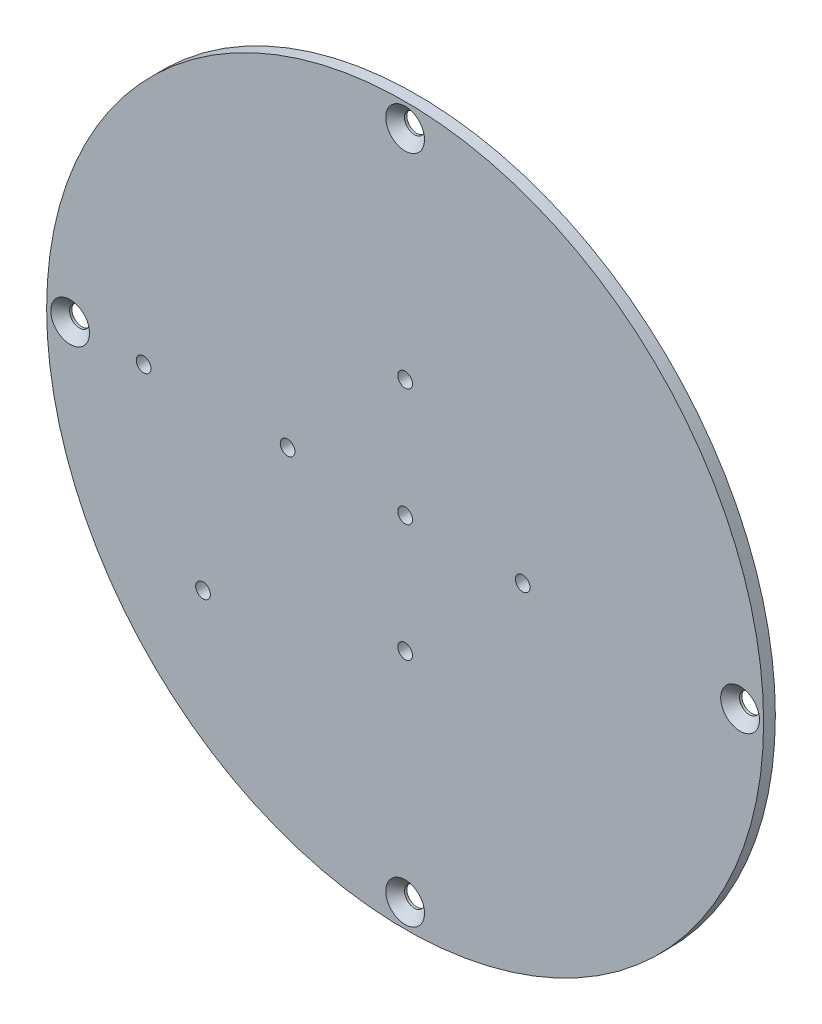
ISO-10303-21;
HEADER;
FILE_DESCRIPTION(('STEP AP214'),'2;1');
FILE_NAME('part.step','',(''),(''),'','','');
FILE_SCHEMA(('AUTOMOTIVE_DESIGN { 1 0 10303 214 1 1 1 1 }'));
ENDSEC;
DATA;
#1=APPLICATION_CONTEXT('core data for automotive mechanical design processes');
#2=APPLICATION_PROTOCOL_DEFINITION('international standard','automotive_design',2000,#1);
#3=PRODUCT_CONTEXT('',#1,'mechanical');
#4=PRODUCT('Part','Part','',(#3));
#5=PRODUCT_RELATED_PRODUCT_CATEGORY('part','',(#4));
#6=PRODUCT_DEFINITION_FORMATION('','',#4);
#7=PRODUCT_DEFINITION_CONTEXT('part definition',#1,'design');
#8=PRODUCT_DEFINITION('design','',#6,#7);
#9=PRODUCT_DEFINITION_SHAPE('','',#8);
#10=(LENGTH_UNIT() NAMED_UNIT(*) SI_UNIT(.MILLI.,.METRE.));
#11=(NAMED_UNIT(*) PLANE_ANGLE_UNIT() SI_UNIT($,.RADIAN.));
#12=(NAMED_UNIT(*) SI_UNIT($,.STERADIAN.) SOLID_ANGLE_UNIT());
#13=UNCERTAINTY_MEASURE_WITH_UNIT(LENGTH_MEASURE(1.E-05),#10,'distance_accuracy_value','');
#14=(GEOMETRIC_REPRESENTATION_CONTEXT(3) GLOBAL_UNCERTAINTY_ASSIGNED_CONTEXT((#13)) GLOBAL_UNIT_ASSIGNED_CONTEXT((#10,
#11,#12)) REPRESENTATION_CONTEXT('',''));
#15=CARTESIAN_POINT('',(0.,0.,0.));
#16=DIRECTION('',(0.,0.,1.));
#17=DIRECTION('',(1.,0.,0.));
#18=AXIS2_PLACEMENT_3D('',#15,#16,#17);
#19=CARTESIAN_POINT('',(0.,0.,2.));
#20=DIRECTION('',(0.,0.,-1.));
#21=DIRECTION('',(-1.,0.,0.));
#22=AXIS2_PLACEMENT_3D('',#19,#20,#21);
#23=CYLINDRICAL_SURFACE('',#22,61.);
#24=CARTESIAN_POINT('',(0.,0.,2.));
#25=DIRECTION('',(0.,0.,1.));
#26=DIRECTION('',(1.,0.,0.));
#27=AXIS2_PLACEMENT_3D('',#24,#25,#26);
#28=CIRCLE('',#27,61.);
#29=CARTESIAN_POINT('',(61.,0.,2.));
#30=VERTEX_POINT('',#29);
#31=EDGE_CURVE('E10',#30,#30,#28,.T.);
#32=ORIENTED_EDGE('',*,*,#31,.F.);
#33=EDGE_LOOP('',(#32));
#34=FACE_BOUND('',#33,.T.);
#35=CARTESIAN_POINT('',(0.,0.,0.));
#36=DIRECTION('',(0.,0.,1.));
#37=DIRECTION('',(1.,0.,0.));
#38=AXIS2_PLACEMENT_3D('',#35,#36,#37);
#39=CIRCLE('',#38,61.);
#40=CARTESIAN_POINT('',(61.,0.,0.));
#41=VERTEX_POINT('',#40);
#42=EDGE_CURVE('E37',#41,#41,#39,.T.);
#43=ORIENTED_EDGE('',*,*,#42,.T.);
#44=EDGE_LOOP('',(#43));
#45=FACE_BOUND('',#44,.T.);
#46=ADVANCED_FACE('F34',(#34,#45),#23,.T.);
#47=CARTESIAN_POINT('',(0.,0.,2.));
#48=DIRECTION('',(0.,0.,1.));
#49=DIRECTION('',(1.,0.,0.));
#50=AXIS2_PLACEMENT_3D('',#47,#48,#49);
#51=PLANE('',#50);
#52=CARTESIAN_POINT('',(-34.3876404494382,-28.2442947215922,2.));
#53=DIRECTION('',(0.,0.,-1.));
#54=DIRECTION('',(-1.,0.,0.));
#55=AXIS2_PLACEMENT_3D('',#52,#53,#54);
#56=CIRCLE('',#55,1.25);
#57=CARTESIAN_POINT('',(-35.6376404494382,-28.2442947215922,2.));
#58=VERTEX_POINT('',#57);
#59=EDGE_CURVE('E117',#58,#58,#56,.T.);
#60=ORIENTED_EDGE('',*,*,#59,.T.);
#61=EDGE_LOOP('',(#60));
#62=FACE_BOUND('',#61,.T.);
#63=CARTESIAN_POINT('',(-44.5,0.,2.));
#64=DIRECTION('',(0.,0.,-1.));
#65=DIRECTION('',(-1.,0.,0.));
#66=AXIS2_PLACEMENT_3D('',#63,#64,#65);
#67=CIRCLE('',#66,1.25);
#68=CARTESIAN_POINT('',(-45.75,0.,2.));
#69=VERTEX_POINT('',#68);
#70=EDGE_CURVE('E111',#69,#69,#67,.T.);
#71=ORIENTED_EDGE('',*,*,#70,.T.);
#72=EDGE_LOOP('',(#71));
#73=FACE_BOUND('',#72,.T.);
#74=CARTESIAN_POINT('',(0.,0.,2.));
#75=DIRECTION('',(0.,0.,1.));
#76=DIRECTION('',(1.,0.,0.));
#77=AXIS2_PLACEMENT_3D('',#74,#75,#76);
#78=CIRCLE('',#77,1.24999999999999);
#79=CARTESIAN_POINT('',(1.24999999999999,0.,2.));
#80=VERTEX_POINT('',#79);
#81=EDGE_CURVE('E105',#80,#80,#78,.T.);
#82=ORIENTED_EDGE('',*,*,#81,.F.);
#83=EDGE_LOOP('',(#82));
#84=FACE_BOUND('',#83,.T.);
#85=CARTESIAN_POINT('',(2.09488880330588E-13,20.,2.));
#86=DIRECTION('',(0.,0.,1.));
#87=DIRECTION('',(1.,0.,0.));
#88=AXIS2_PLACEMENT_3D('',#85,#86,#87);
#89=CIRCLE('',#88,1.25);
#90=CARTESIAN_POINT('',(1.25000000000021,20.,2.));
#91=VERTEX_POINT('',#90);
#92=EDGE_CURVE('E99',#91,#91,#89,.T.);
#93=ORIENTED_EDGE('',*,*,#92,.F.);
#94=EDGE_LOOP('',(#93));
#95=FACE_BOUND('',#94,.T.);
#96=CARTESIAN_POINT('',(-20.,0.,2.));
#97=DIRECTION('',(0.,0.,1.));
#98=DIRECTION('',(1.,0.,0.));
#99=AXIS2_PLACEMENT_3D('',#96,#97,#98);
#100=CIRCLE('',#99,1.25);
#101=CARTESIAN_POINT('',(-18.75,0.,2.));
#102=VERTEX_POINT('',#101);
#103=EDGE_CURVE('E93',#102,#102,#100,.T.);
#104=ORIENTED_EDGE('',*,*,#103,.F.);
#105=EDGE_LOOP('',(#104));
#106=FACE_BOUND('',#105,.T.);
#107=CARTESIAN_POINT('',(0.,-20.,2.));
#108=DIRECTION('',(0.,0.,1.));
#109=DIRECTION('',(1.,0.,0.));
#110=AXIS2_PLACEMENT_3D('',#107,#108,#109);
#111=CIRCLE('',#110,1.25);
#112=CARTESIAN_POINT('',(1.24999999999993,-20.,2.));
#113=VERTEX_POINT('',#112);
#114=EDGE_CURVE('E87',#113,#113,#111,.T.);
#115=ORIENTED_EDGE('',*,*,#114,.F.);
#116=EDGE_LOOP('',(#115));
#117=FACE_BOUND('',#116,.T.);
#118=CARTESIAN_POINT('',(20.,0.,2.));
#119=DIRECTION('',(0.,0.,1.));
#120=DIRECTION('',(1.,0.,0.));
#121=AXIS2_PLACEMENT_3D('',#118,#119,#120);
#122=CIRCLE('',#121,1.25);
#123=CARTESIAN_POINT('',(21.25,0.,2.));
#124=VERTEX_POINT('',#123);
#125=EDGE_CURVE('E81',#124,#124,#122,.T.);
#126=ORIENTED_EDGE('',*,*,#125,.F.);
#127=EDGE_LOOP('',(#126));
#128=FACE_BOUND('',#127,.T.);
#129=CARTESIAN_POINT('',(-57.,5.97043308942176E-13,2.));
#130=DIRECTION('',(0.,0.,1.));
#131=DIRECTION('',(1.,0.,0.));
#132=AXIS2_PLACEMENT_3D('',#129,#130,#131);
#133=CIRCLE('',#132,3.3);
#134=CARTESIAN_POINT('',(-53.7,5.97043308942176E-13,2.));
#135=VERTEX_POINT('',#134);
#136=EDGE_CURVE('E78',#135,#135,#133,.T.);
#137=ORIENTED_EDGE('',*,*,#136,.F.);
#138=EDGE_LOOP('',(#137));
#139=FACE_BOUND('',#138,.T.);
#140=CARTESIAN_POINT('',(0.,-57.,2.));
#141=DIRECTION('',(0.,0.,1.));
#142=DIRECTION('',(1.,0.,0.));
#143=AXIS2_PLACEMENT_3D('',#140,#141,#142);
#144=CIRCLE('',#143,3.3);
#145=CARTESIAN_POINT('',(3.3,-57.,2.));
#146=VERTEX_POINT('',#145);
#147=EDGE_CURVE('E69',#146,#146,#144,.T.);
#148=ORIENTED_EDGE('',*,*,#147,.F.);
#149=EDGE_LOOP('',(#148));
#150=FACE_BOUND('',#149,.T.);
#151=CARTESIAN_POINT('',(57.,-1.99014436314059E-13,2.));
#152=DIRECTION('',(0.,0.,1.));
#153=DIRECTION('',(1.,0.,0.));
#154=AXIS2_PLACEMENT_3D('',#151,#152,#153);
#155=CIRCLE('',#154,3.3);
#156=CARTESIAN_POINT('',(60.3,-1.99014436314059E-13,2.));
#157=VERTEX_POINT('',#156);
#158=EDGE_CURVE('E60',#157,#157,#155,.T.);
#159=ORIENTED_EDGE('',*,*,#158,.F.);
#160=EDGE_LOOP('',(#159));
#161=FACE_BOUND('',#160,.T.);
#162=CARTESIAN_POINT('',(0.,57.,2.));
#163=DIRECTION('',(0.,0.,1.));
#164=DIRECTION('',(1.,0.,0.));
#165=AXIS2_PLACEMENT_3D('',#162,#163,#164);
#166=CIRCLE('',#165,3.3);
#167=CARTESIAN_POINT('',(3.3,57.,2.));
#168=VERTEX_POINT('',#167);
#169=EDGE_CURVE('E51',#168,#168,#166,.T.);
#170=ORIENTED_EDGE('',*,*,#169,.F.);
#171=EDGE_LOOP('',(#170));
#172=FACE_BOUND('',#171,.T.);
#173=ORIENTED_EDGE('',*,*,#31,.T.);
#174=EDGE_LOOP('',(#173));
#175=FACE_BOUND('',#174,.T.);
#176=ADVANCED_FACE('F130',(#62,#73,#84,#95,#106,#117,#128,#139,#150,#161,#172,#175),#51,.T.);
#177=CARTESIAN_POINT('',(0.,0.,0.));
#178=DIRECTION('',(0.,0.,1.));
#179=DIRECTION('',(1.,0.,0.));
#180=AXIS2_PLACEMENT_3D('',#177,#178,#179);
#181=PLANE('',#180);
#182=CARTESIAN_POINT('',(-34.3876404494382,-28.2442947215922,0.));
#183=DIRECTION('',(0.,0.,-1.));
#184=DIRECTION('',(-1.,0.,0.));
#185=AXIS2_PLACEMENT_3D('',#182,#183,#184);
#186=CIRCLE('',#185,1.24999999999999);
#187=CARTESIAN_POINT('',(-35.6376404494382,-28.2442947215922,0.));
#188=VERTEX_POINT('',#187);
#189=EDGE_CURVE('E120',#188,#188,#186,.T.);
#190=ORIENTED_EDGE('',*,*,#189,.F.);
#191=EDGE_LOOP('',(#190));
#192=FACE_BOUND('',#191,.T.);
#193=CARTESIAN_POINT('',(-44.5,0.,0.));
#194=DIRECTION('',(0.,0.,-1.));
#195=DIRECTION('',(-1.,0.,0.));
#196=AXIS2_PLACEMENT_3D('',#193,#194,#195);
#197=CIRCLE('',#196,1.24999999999999);
#198=CARTESIAN_POINT('',(-45.75,0.,0.));
#199=VERTEX_POINT('',#198);
#200=EDGE_CURVE('E114',#199,#199,#197,.T.);
#201=ORIENTED_EDGE('',*,*,#200,.F.);
#202=EDGE_LOOP('',(#201));
#203=FACE_BOUND('',#202,.T.);
#204=CARTESIAN_POINT('',(0.,0.,0.));
#205=DIRECTION('',(0.,0.,-1.));
#206=DIRECTION('',(-1.,0.,0.));
#207=AXIS2_PLACEMENT_3D('',#204,#205,#206);
#208=CIRCLE('',#207,1.24999999999999);
#209=CARTESIAN_POINT('',(-1.24999999999999,0.,0.));
#210=VERTEX_POINT('',#209);
#211=EDGE_CURVE('E108',#210,#210,#208,.T.);
#212=ORIENTED_EDGE('',*,*,#211,.F.);
#213=EDGE_LOOP('',(#212));
#214=FACE_BOUND('',#213,.T.);
#215=CARTESIAN_POINT('',(2.09488880330588E-13,20.,0.));
#216=DIRECTION('',(0.,0.,-1.));
#217=DIRECTION('',(-1.,0.,0.));
#218=AXIS2_PLACEMENT_3D('',#215,#216,#217);
#219=CIRCLE('',#218,1.25);
#220=CARTESIAN_POINT('',(-1.24999999999979,20.,0.));
#221=VERTEX_POINT('',#220);
#222=EDGE_CURVE('E102',#221,#221,#219,.T.);
#223=ORIENTED_EDGE('',*,*,#222,.F.);
#224=EDGE_LOOP('',(#223));
#225=FACE_BOUND('',#224,.T.);
#226=CARTESIAN_POINT('',(-20.,0.,0.));
#227=DIRECTION('',(0.,0.,-1.));
#228=DIRECTION('',(-1.,0.,0.));
#229=AXIS2_PLACEMENT_3D('',#226,#227,#228);
#230=CIRCLE('',#229,1.25);
#231=CARTESIAN_POINT('',(-21.25,0.,0.));
#232=VERTEX_POINT('',#231);
#233=EDGE_CURVE('E96',#232,#232,#230,.T.);
#234=ORIENTED_EDGE('',*,*,#233,.F.);
#235=EDGE_LOOP('',(#234));
#236=FACE_BOUND('',#235,.T.);
#237=CARTESIAN_POINT('',(0.,-20.,0.));
#238=DIRECTION('',(0.,0.,-1.));
#239=DIRECTION('',(-1.,0.,0.));
#240=AXIS2_PLACEMENT_3D('',#237,#238,#239);
#241=CIRCLE('',#240,1.25);
#242=CARTESIAN_POINT('',(-1.25000000000007,-20.,0.));
#243=VERTEX_POINT('',#242);
#244=EDGE_CURVE('E90',#243,#243,#241,.T.);
#245=ORIENTED_EDGE('',*,*,#244,.F.);
#246=EDGE_LOOP('',(#245));
#247=FACE_BOUND('',#246,.T.);
#248=CARTESIAN_POINT('',(20.,0.,0.));
#249=DIRECTION('',(0.,0.,-1.));
#250=DIRECTION('',(-1.,0.,0.));
#251=AXIS2_PLACEMENT_3D('',#248,#249,#250);
#252=CIRCLE('',#251,1.25);
#253=CARTESIAN_POINT('',(18.75,0.,0.));
#254=VERTEX_POINT('',#253);
#255=EDGE_CURVE('E84',#254,#254,#252,.T.);
#256=ORIENTED_EDGE('',*,*,#255,.F.);
#257=EDGE_LOOP('',(#256));
#258=FACE_BOUND('',#257,.T.);
#259=CARTESIAN_POINT('',(-57.,5.97043308942176E-13,0.));
#260=DIRECTION('',(0.,0.,1.));
#261=DIRECTION('',(1.,0.,0.));
#262=AXIS2_PLACEMENT_3D('',#259,#260,#261);
#263=CIRCLE('',#262,1.7);
#264=CARTESIAN_POINT('',(-55.3,5.97043308942176E-13,0.));
#265=VERTEX_POINT('',#264);
#266=EDGE_CURVE('E72',#265,#265,#263,.T.);
#267=ORIENTED_EDGE('',*,*,#266,.T.);
#268=EDGE_LOOP('',(#267));
#269=FACE_BOUND('',#268,.T.);
#270=CARTESIAN_POINT('',(0.,-57.,0.));
#271=DIRECTION('',(0.,0.,1.));
#272=DIRECTION('',(1.,0.,0.));
#273=AXIS2_PLACEMENT_3D('',#270,#271,#272);
#274=CIRCLE('',#273,1.7);
#275=CARTESIAN_POINT('',(1.7,-57.,0.));
#276=VERTEX_POINT('',#275);
#277=EDGE_CURVE('E63',#276,#276,#274,.T.);
#278=ORIENTED_EDGE('',*,*,#277,.T.);
#279=EDGE_LOOP('',(#278));
#280=FACE_BOUND('',#279,.T.);
#281=CARTESIAN_POINT('',(57.,-1.99014436314059E-13,0.));
#282=DIRECTION('',(0.,0.,1.));
#283=DIRECTION('',(1.,0.,0.));
#284=AXIS2_PLACEMENT_3D('',#281,#282,#283);
#285=CIRCLE('',#284,1.7);
#286=CARTESIAN_POINT('',(58.7,-1.99014436314059E-13,0.));
#287=VERTEX_POINT('',#286);
#288=EDGE_CURVE('E54',#287,#287,#285,.T.);
#289=ORIENTED_EDGE('',*,*,#288,.T.);
#290=EDGE_LOOP('',(#289));
#291=FACE_BOUND('',#290,.T.);
#292=CARTESIAN_POINT('',(0.,57.,0.));
#293=DIRECTION('',(0.,0.,1.));
#294=DIRECTION('',(1.,0.,0.));
#295=AXIS2_PLACEMENT_3D('',#292,#293,#294);
#296=CIRCLE('',#295,1.7);
#297=CARTESIAN_POINT('',(1.7,57.,0.));
#298=VERTEX_POINT('',#297);
#299=EDGE_CURVE('E44',#298,#298,#296,.T.);
#300=ORIENTED_EDGE('',*,*,#299,.T.);
#301=EDGE_LOOP('',(#300));
#302=FACE_BOUND('',#301,.T.);
#303=ORIENTED_EDGE('',*,*,#42,.F.);
#304=EDGE_LOOP('',(#303));
#305=FACE_BOUND('',#304,.T.);
#306=ADVANCED_FACE('F126',(#192,#203,#214,#225,#236,#247,#258,#269,#280,#291,#302,#305),#181,.F.);
#307=CARTESIAN_POINT('',(0.,57.,2.));
#308=DIRECTION('',(0.,0.,1.));
#309=DIRECTION('',(1.,0.,0.));
#310=AXIS2_PLACEMENT_3D('',#307,#308,#309);
#311=CYLINDRICAL_SURFACE('',#310,1.69999999999999);
#312=ORIENTED_EDGE('',*,*,#299,.F.);
#313=EDGE_LOOP('',(#312));
#314=FACE_BOUND('',#313,.T.);
#315=CARTESIAN_POINT('',(0.,57.,0.399999999999996));
#316=DIRECTION('',(0.,0.,1.));
#317=DIRECTION('',(1.,0.,0.));
#318=AXIS2_PLACEMENT_3D('',#315,#316,#317);
#319=CIRCLE('',#318,1.69999999999999);
#320=CARTESIAN_POINT('',(1.69999999999999,57.,0.399999999999996));
#321=VERTEX_POINT('',#320);
#322=EDGE_CURVE('E48',#321,#321,#319,.T.);
#323=ORIENTED_EDGE('',*,*,#322,.T.);
#324=EDGE_LOOP('',(#323));
#325=FACE_BOUND('',#324,.T.);
#326=ADVANCED_FACE('F129',(#314,#325),#311,.F.);
#327=CARTESIAN_POINT('',(0.,57.,2.));
#328=DIRECTION('',(0.,0.,1.));
#329=DIRECTION('',(1.,0.,0.));
#330=AXIS2_PLACEMENT_3D('',#327,#328,#329);
#331=CONICAL_SURFACE('',#330,3.3,0.78539816339745);
#332=ORIENTED_EDGE('',*,*,#322,.F.);
#333=EDGE_LOOP('',(#332));
#334=FACE_BOUND('',#333,.T.);
#335=ORIENTED_EDGE('',*,*,#169,.T.);
#336=EDGE_LOOP('',(#335));
#337=FACE_BOUND('',#336,.T.);
#338=ADVANCED_FACE('F166',(#334,#337),#331,.F.);
#339=CARTESIAN_POINT('',(57.,-1.99014436314059E-13,2.));
#340=DIRECTION('',(0.,0.,1.));
#341=DIRECTION('',(1.,0.,0.));
#342=AXIS2_PLACEMENT_3D('',#339,#340,#341);
#343=CYLINDRICAL_SURFACE('',#342,1.69999999999999);
#344=ORIENTED_EDGE('',*,*,#288,.F.);
#345=EDGE_LOOP('',(#344));
#346=FACE_BOUND('',#345,.T.);
#347=CARTESIAN_POINT('',(57.,-1.99014436314059E-13,0.399999999999996));
#348=DIRECTION('',(0.,0.,1.));
#349=DIRECTION('',(1.,0.,0.));
#350=AXIS2_PLACEMENT_3D('',#347,#348,#349);
#351=CIRCLE('',#350,1.69999999999999);
#352=CARTESIAN_POINT('',(58.7,-1.99014436314059E-13,0.399999999999996));
#353=VERTEX_POINT('',#352);
#354=EDGE_CURVE('E57',#353,#353,#351,.T.);
#355=ORIENTED_EDGE('',*,*,#354,.T.);
#356=EDGE_LOOP('',(#355));
#357=FACE_BOUND('',#356,.T.);
#358=ADVANCED_FACE('F170',(#346,#357),#343,.F.);
#359=CARTESIAN_POINT('',(57.,-1.99014436314059E-13,2.));
#360=DIRECTION('',(0.,0.,1.));
#361=DIRECTION('',(1.,0.,0.));
#362=AXIS2_PLACEMENT_3D('',#359,#360,#361);
#363=CONICAL_SURFACE('',#362,3.3,0.785398163397452);
#364=ORIENTED_EDGE('',*,*,#354,.F.);
#365=EDGE_LOOP('',(#364));
#366=FACE_BOUND('',#365,.T.);
#367=ORIENTED_EDGE('',*,*,#158,.T.);
#368=EDGE_LOOP('',(#367));
#369=FACE_BOUND('',#368,.T.);
#370=ADVANCED_FACE('F174',(#366,#369),#363,.F.);
#371=CARTESIAN_POINT('',(0.,-57.,2.));
#372=DIRECTION('',(0.,0.,1.));
#373=DIRECTION('',(1.,0.,0.));
#374=AXIS2_PLACEMENT_3D('',#371,#372,#373);
#375=CYLINDRICAL_SURFACE('',#374,1.69999999999999);
#376=ORIENTED_EDGE('',*,*,#277,.F.);
#377=EDGE_LOOP('',(#376));
#378=FACE_BOUND('',#377,.T.);
#379=CARTESIAN_POINT('',(0.,-57.,0.399999999999996));
#380=DIRECTION('',(0.,0.,1.));
#381=DIRECTION('',(1.,0.,0.));
#382=AXIS2_PLACEMENT_3D('',#379,#380,#381);
#383=CIRCLE('',#382,1.69999999999999);
#384=CARTESIAN_POINT('',(1.69999999999999,-57.,0.399999999999996));
#385=VERTEX_POINT('',#384);
#386=EDGE_CURVE('E66',#385,#385,#383,.T.);
#387=ORIENTED_EDGE('',*,*,#386,.T.);
#388=EDGE_LOOP('',(#387));
#389=FACE_BOUND('',#388,.T.);
#390=ADVANCED_FACE('F178',(#378,#389),#375,.F.);
#391=CARTESIAN_POINT('',(0.,-57.,2.));
#392=DIRECTION('',(0.,0.,1.));
#393=DIRECTION('',(1.,0.,0.));
#394=AXIS2_PLACEMENT_3D('',#391,#392,#393);
#395=CONICAL_SURFACE('',#394,3.3,0.78539816339745);
#396=ORIENTED_EDGE('',*,*,#386,.F.);
#397=EDGE_LOOP('',(#396));
#398=FACE_BOUND('',#397,.T.);
#399=ORIENTED_EDGE('',*,*,#147,.T.);
#400=EDGE_LOOP('',(#399));
#401=FACE_BOUND('',#400,.T.);
#402=ADVANCED_FACE('F182',(#398,#401),#395,.F.);
#403=CARTESIAN_POINT('',(-57.,5.97043308942176E-13,2.));
#404=DIRECTION('',(0.,0.,1.));
#405=DIRECTION('',(1.,0.,0.));
#406=AXIS2_PLACEMENT_3D('',#403,#404,#405);
#407=CYLINDRICAL_SURFACE('',#406,1.69999999999999);
#408=ORIENTED_EDGE('',*,*,#266,.F.);
#409=EDGE_LOOP('',(#408));
#410=FACE_BOUND('',#409,.T.);
#411=CARTESIAN_POINT('',(-57.,5.97043308942176E-13,0.399999999999996));
#412=DIRECTION('',(0.,0.,1.));
#413=DIRECTION('',(1.,0.,0.));
#414=AXIS2_PLACEMENT_3D('',#411,#412,#413);
#415=CIRCLE('',#414,1.69999999999999);
#416=CARTESIAN_POINT('',(-55.3,5.97043308942176E-13,0.399999999999996));
#417=VERTEX_POINT('',#416);
#418=EDGE_CURVE('E75',#417,#417,#415,.T.);
#419=ORIENTED_EDGE('',*,*,#418,.T.);
#420=EDGE_LOOP('',(#419));
#421=FACE_BOUND('',#420,.T.);
#422=ADVANCED_FACE('F186',(#410,#421),#407,.F.);
#423=CARTESIAN_POINT('',(-57.,5.97043308942176E-13,2.));
#424=DIRECTION('',(0.,0.,1.));
#425=DIRECTION('',(1.,0.,0.));
#426=AXIS2_PLACEMENT_3D('',#423,#424,#425);
#427=CONICAL_SURFACE('',#426,3.3,0.785398163397452);
#428=ORIENTED_EDGE('',*,*,#418,.F.);
#429=EDGE_LOOP('',(#428));
#430=FACE_BOUND('',#429,.T.);
#431=ORIENTED_EDGE('',*,*,#136,.T.);
#432=EDGE_LOOP('',(#431));
#433=FACE_BOUND('',#432,.T.);
#434=ADVANCED_FACE('F190',(#430,#433),#427,.F.);
#435=CARTESIAN_POINT('',(20.,0.,0.));
#436=DIRECTION('',(0.,0.,-1.));
#437=DIRECTION('',(-1.,0.,0.));
#438=AXIS2_PLACEMENT_3D('',#435,#436,#437);
#439=CYLINDRICAL_SURFACE('',#438,1.25);
#440=ORIENTED_EDGE('',*,*,#255,.T.);
#441=EDGE_LOOP('',(#440));
#442=FACE_BOUND('',#441,.T.);
#443=ORIENTED_EDGE('',*,*,#125,.T.);
#444=EDGE_LOOP('',(#443));
#445=FACE_BOUND('',#444,.T.);
#446=ADVANCED_FACE('F194',(#442,#445),#439,.F.);
#447=CARTESIAN_POINT('',(0.,-20.,0.));
#448=DIRECTION('',(0.,0.,-1.));
#449=DIRECTION('',(-1.,0.,0.));
#450=AXIS2_PLACEMENT_3D('',#447,#448,#449);
#451=CYLINDRICAL_SURFACE('',#450,1.25);
#452=ORIENTED_EDGE('',*,*,#244,.T.);
#453=EDGE_LOOP('',(#452));
#454=FACE_BOUND('',#453,.T.);
#455=ORIENTED_EDGE('',*,*,#114,.T.);
#456=EDGE_LOOP('',(#455));
#457=FACE_BOUND('',#456,.T.);
#458=ADVANCED_FACE('F198',(#454,#457),#451,.F.);
#459=CARTESIAN_POINT('',(-20.,0.,0.));
#460=DIRECTION('',(0.,0.,-1.));
#461=DIRECTION('',(-1.,0.,0.));
#462=AXIS2_PLACEMENT_3D('',#459,#460,#461);
#463=CYLINDRICAL_SURFACE('',#462,1.25);
#464=ORIENTED_EDGE('',*,*,#233,.T.);
#465=EDGE_LOOP('',(#464));
#466=FACE_BOUND('',#465,.T.);
#467=ORIENTED_EDGE('',*,*,#103,.T.);
#468=EDGE_LOOP('',(#467));
#469=FACE_BOUND('',#468,.T.);
#470=ADVANCED_FACE('F202',(#466,#469),#463,.F.);
#471=CARTESIAN_POINT('',(2.09488880330588E-13,20.,0.));
#472=DIRECTION('',(0.,0.,-1.));
#473=DIRECTION('',(-1.,0.,0.));
#474=AXIS2_PLACEMENT_3D('',#471,#472,#473);
#475=CYLINDRICAL_SURFACE('',#474,1.25);
#476=ORIENTED_EDGE('',*,*,#222,.T.);
#477=EDGE_LOOP('',(#476));
#478=FACE_BOUND('',#477,.T.);
#479=ORIENTED_EDGE('',*,*,#92,.T.);
#480=EDGE_LOOP('',(#479));
#481=FACE_BOUND('',#480,.T.);
#482=ADVANCED_FACE('F206',(#478,#481),#475,.F.);
#483=CARTESIAN_POINT('',(0.,0.,0.));
#484=DIRECTION('',(0.,0.,-1.));
#485=DIRECTION('',(-1.,0.,0.));
#486=AXIS2_PLACEMENT_3D('',#483,#484,#485);
#487=CYLINDRICAL_SURFACE('',#486,1.24999999999999);
#488=ORIENTED_EDGE('',*,*,#211,.T.);
#489=EDGE_LOOP('',(#488));
#490=FACE_BOUND('',#489,.T.);
#491=ORIENTED_EDGE('',*,*,#81,.T.);
#492=EDGE_LOOP('',(#491));
#493=FACE_BOUND('',#492,.T.);
#494=ADVANCED_FACE('F210',(#490,#493),#487,.F.);
#495=CARTESIAN_POINT('',(-44.5,0.,0.));
#496=DIRECTION('',(0.,0.,-1.));
#497=DIRECTION('',(-1.,0.,0.));
#498=AXIS2_PLACEMENT_3D('',#495,#496,#497);
#499=CYLINDRICAL_SURFACE('',#498,1.24999999999999);
#500=ORIENTED_EDGE('',*,*,#70,.F.);
#501=EDGE_LOOP('',(#500));
#502=FACE_BOUND('',#501,.T.);
#503=ORIENTED_EDGE('',*,*,#200,.T.);
#504=EDGE_LOOP('',(#503));
#505=FACE_BOUND('',#504,.T.);
#506=ADVANCED_FACE('F214',(#502,#505),#499,.F.);
#507=CARTESIAN_POINT('',(-34.3876404494382,-28.2442947215922,0.));
#508=DIRECTION('',(0.,0.,-1.));
#509=DIRECTION('',(-1.,0.,0.));
#510=AXIS2_PLACEMENT_3D('',#507,#508,#509);
#511=CYLINDRICAL_SURFACE('',#510,1.24999999999999);
#512=ORIENTED_EDGE('',*,*,#59,.F.);
#513=EDGE_LOOP('',(#512));
#514=FACE_BOUND('',#513,.T.);
#515=ORIENTED_EDGE('',*,*,#189,.T.);
#516=EDGE_LOOP('',(#515));
#517=FACE_BOUND('',#516,.T.);
#518=ADVANCED_FACE('F124',(#514,#517),#511,.F.);
#519=CLOSED_SHELL('',(#46,#176,#306,#326,#338,#358,#370,#390,#402,#422,#434,#446,#458,#470,#482,
#494,#506,#518));
#520=MANIFOLD_SOLID_BREP('B2',#519);
#521=ADVANCED_BREP_SHAPE_REPRESENTATION('',(#18,#520),#14);
#522=SHAPE_DEFINITION_REPRESENTATION(#9,#521);
ENDSEC;
END-ISO-10303-21;
